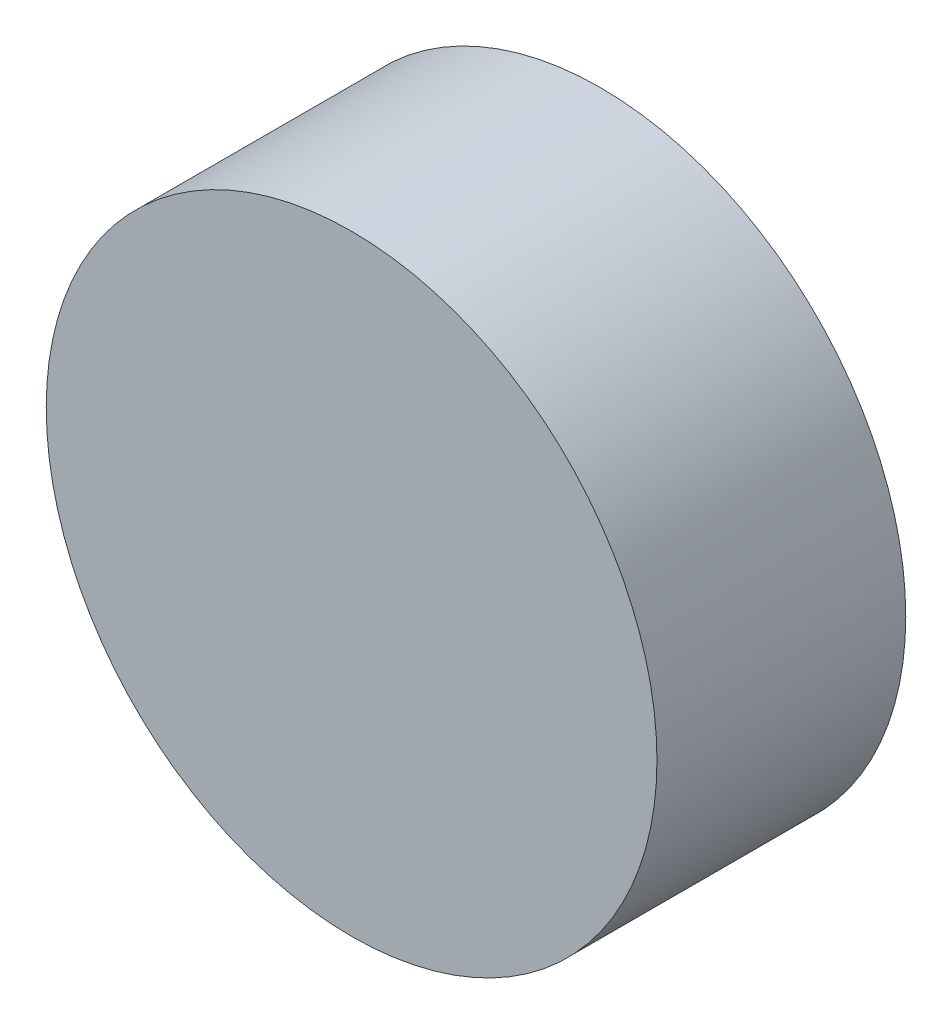
ISO-10303-21;
HEADER;
FILE_DESCRIPTION(('STEP AP214'),'2;1');
FILE_NAME('part.step','',(''),(''),'','','');
FILE_SCHEMA(('AUTOMOTIVE_DESIGN { 1 0 10303 214 1 1 1 1 }'));
ENDSEC;
DATA;
#1=APPLICATION_CONTEXT('core data for automotive mechanical design processes');
#2=APPLICATION_PROTOCOL_DEFINITION('international standard','automotive_design',2000,#1);
#3=PRODUCT_CONTEXT('',#1,'mechanical');
#4=PRODUCT('Part','Part','',(#3));
#5=PRODUCT_RELATED_PRODUCT_CATEGORY('part','',(#4));
#6=PRODUCT_DEFINITION_FORMATION('','',#4);
#7=PRODUCT_DEFINITION_CONTEXT('part definition',#1,'design');
#8=PRODUCT_DEFINITION('design','',#6,#7);
#9=PRODUCT_DEFINITION_SHAPE('','',#8);
#10=(LENGTH_UNIT() NAMED_UNIT(*) SI_UNIT(.MILLI.,.METRE.));
#11=(NAMED_UNIT(*) PLANE_ANGLE_UNIT() SI_UNIT($,.RADIAN.));
#12=(NAMED_UNIT(*) SI_UNIT($,.STERADIAN.) SOLID_ANGLE_UNIT());
#13=UNCERTAINTY_MEASURE_WITH_UNIT(LENGTH_MEASURE(1.E-05),#10,'distance_accuracy_value','');
#14=(GEOMETRIC_REPRESENTATION_CONTEXT(3) GLOBAL_UNCERTAINTY_ASSIGNED_CONTEXT((#13)) GLOBAL_UNIT_ASSIGNED_CONTEXT((#10,
#11,#12)) REPRESENTATION_CONTEXT('',''));
#15=CARTESIAN_POINT('',(0.,0.,0.));
#16=DIRECTION('',(0.,0.,1.));
#17=DIRECTION('',(1.,0.,0.));
#18=AXIS2_PLACEMENT_3D('',#15,#16,#17);
#19=CARTESIAN_POINT('',(0.,0.,0.3));
#20=DIRECTION('',(0.,0.,1.));
#21=DIRECTION('',(1.,0.,0.));
#22=AXIS2_PLACEMENT_3D('',#19,#20,#21);
#23=PLANE('',#22);
#24=CARTESIAN_POINT('',(0.,0.,0.3));
#25=DIRECTION('',(0.,0.,-1.));
#26=DIRECTION('',(1.,0.,0.));
#27=AXIS2_PLACEMENT_3D('',#24,#25,#26);
#28=CIRCLE('',#27,1.35);
#29=CARTESIAN_POINT('',(1.35,0.,0.3));
#30=VERTEX_POINT('',#29);
#31=EDGE_CURVE('E42',#30,#30,#28,.T.);
#32=ORIENTED_EDGE('',*,*,#31,.T.);
#33=EDGE_LOOP('',(#32));
#34=FACE_BOUND('',#33,.T.);
#35=ADVANCED_FACE('F17',(#34),#23,.F.);
#36=CARTESIAN_POINT('',(0.,0.,1.4));
#37=DIRECTION('',(0.,0.,1.));
#38=DIRECTION('',(1.,0.,0.));
#39=AXIS2_PLACEMENT_3D('',#36,#37,#38);
#40=PLANE('',#39);
#41=CARTESIAN_POINT('',(0.,0.,1.4));
#42=DIRECTION('',(0.,0.,1.));
#43=DIRECTION('',(-1.,0.,0.));
#44=AXIS2_PLACEMENT_3D('',#41,#42,#43);
#45=CIRCLE('',#44,1.35);
#46=CARTESIAN_POINT('',(1.35,0.,1.4));
#47=VERTEX_POINT('',#46);
#48=EDGE_CURVE('E11',#47,#47,#45,.T.);
#49=ORIENTED_EDGE('',*,*,#48,.T.);
#50=EDGE_LOOP('',(#49));
#51=FACE_BOUND('',#50,.T.);
#52=ADVANCED_FACE('F63',(#51),#40,.T.);
#53=CARTESIAN_POINT('',(0.,0.,1.4));
#54=DIRECTION('',(0.,0.,-1.));
#55=DIRECTION('',(-1.,0.,0.));
#56=AXIS2_PLACEMENT_3D('',#53,#54,#55);
#57=CYLINDRICAL_SURFACE('',#56,1.35);
#58=ORIENTED_EDGE('',*,*,#31,.F.);
#59=DIRECTION('',(0.,0.,1.));
#60=VECTOR('',#59,1.);
#61=CARTESIAN_POINT('',(1.35,0.,1.4));
#62=LINE('',#61,#60);
#63=EDGE_CURVE('E25',#30,#47,#62,.T.);
#64=ORIENTED_EDGE('',*,*,#63,.T.);
#65=ORIENTED_EDGE('',*,*,#48,.F.);
#66=ORIENTED_EDGE('',*,*,#63,.F.);
#67=EDGE_LOOP('',(#58,#64,#65,#66));
#68=FACE_BOUND('',#67,.T.);
#69=ADVANCED_FACE('F41',(#68),#57,.T.);
#70=CLOSED_SHELL('',(#35,#52,#69));
#71=MANIFOLD_SOLID_BREP('B1',#70);
#72=ADVANCED_BREP_SHAPE_REPRESENTATION('',(#18,#71),#14);
#73=SHAPE_DEFINITION_REPRESENTATION(#9,#72);
ENDSEC;
END-ISO-10303-21;
